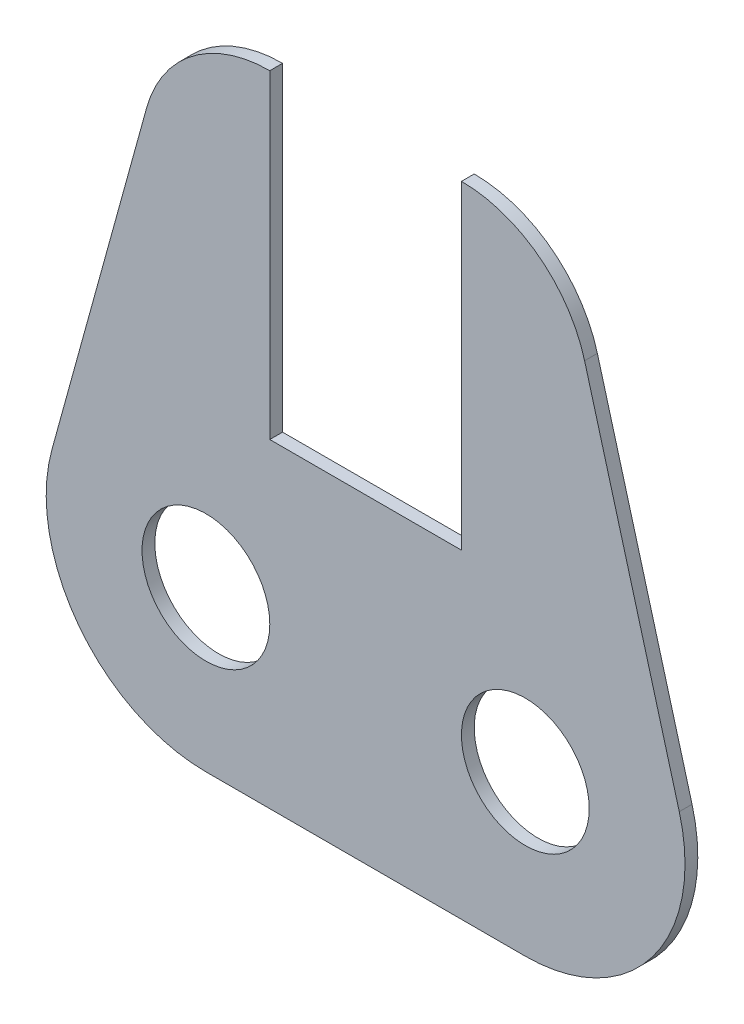
ISO-10303-21;
HEADER;
FILE_DESCRIPTION(('STEP AP214'),'2;1');
FILE_NAME('part.step','',(''),(''),'','','');
FILE_SCHEMA(('AUTOMOTIVE_DESIGN { 1 0 10303 214 1 1 1 1 }'));
ENDSEC;
DATA;
#1=APPLICATION_CONTEXT('core data for automotive mechanical design processes');
#2=APPLICATION_PROTOCOL_DEFINITION('international standard','automotive_design',2000,#1);
#3=PRODUCT_CONTEXT('',#1,'mechanical');
#4=PRODUCT('Part','Part','',(#3));
#5=PRODUCT_RELATED_PRODUCT_CATEGORY('part','',(#4));
#6=PRODUCT_DEFINITION_FORMATION('','',#4);
#7=PRODUCT_DEFINITION_CONTEXT('part definition',#1,'design');
#8=PRODUCT_DEFINITION('design','',#6,#7);
#9=PRODUCT_DEFINITION_SHAPE('','',#8);
#10=(LENGTH_UNIT() NAMED_UNIT(*) SI_UNIT(.MILLI.,.METRE.));
#11=(NAMED_UNIT(*) PLANE_ANGLE_UNIT() SI_UNIT($,.RADIAN.));
#12=(NAMED_UNIT(*) SI_UNIT($,.STERADIAN.) SOLID_ANGLE_UNIT());
#13=UNCERTAINTY_MEASURE_WITH_UNIT(LENGTH_MEASURE(1.E-05),#10,'distance_accuracy_value','');
#14=(GEOMETRIC_REPRESENTATION_CONTEXT(3) GLOBAL_UNCERTAINTY_ASSIGNED_CONTEXT((#13)) GLOBAL_UNIT_ASSIGNED_CONTEXT((#10,
#11,#12)) REPRESENTATION_CONTEXT('',''));
#15=CARTESIAN_POINT('',(0.,0.,0.));
#16=DIRECTION('',(0.,0.,1.));
#17=DIRECTION('',(1.,0.,0.));
#18=AXIS2_PLACEMENT_3D('',#15,#16,#17);
#19=CARTESIAN_POINT('',(15.0000000000186,80.,2.));
#20=DIRECTION('',(0.,0.,-1.));
#21=DIRECTION('',(-1.,0.,0.));
#22=AXIS2_PLACEMENT_3D('',#19,#20,#21);
#23=PLANE('',#22);
#24=CARTESIAN_POINT('',(15.0000000000186,80.,2.));
#25=DIRECTION('',(0.,0.,1.));
#26=DIRECTION('',(-1.,0.,0.));
#27=AXIS2_PLACEMENT_3D('',#24,#25,#26);
#28=CIRCLE('',#27,20.);
#29=CARTESIAN_POINT('',(34.2798014158517,85.3187646466109,2.));
#30=VERTEX_POINT('',#29);
#31=CARTESIAN_POINT('',(15.,100.,2.));
#32=VERTEX_POINT('',#31);
#33=EDGE_CURVE('E163',#30,#32,#28,.T.);
#34=ORIENTED_EDGE('',*,*,#33,.T.);
#35=DIRECTION('',(0.,-1.,0.));
#36=VECTOR('',#35,1.);
#37=CARTESIAN_POINT('',(15.,50.,2.));
#38=LINE('',#37,#36);
#39=CARTESIAN_POINT('',(15.,50.,2.));
#40=VERTEX_POINT('',#39);
#41=EDGE_CURVE('E101',#32,#40,#38,.T.);
#42=ORIENTED_EDGE('',*,*,#41,.T.);
#43=DIRECTION('',(-1.,0.,0.));
#44=VECTOR('',#43,1.);
#45=CARTESIAN_POINT('',(-15.,50.,2.));
#46=LINE('',#45,#44);
#47=CARTESIAN_POINT('',(-15.,50.,2.));
#48=VERTEX_POINT('',#47);
#49=EDGE_CURVE('E184',#40,#48,#46,.T.);
#50=ORIENTED_EDGE('',*,*,#49,.T.);
#51=DIRECTION('',(0.,1.,0.));
#52=VECTOR('',#51,1.);
#53=CARTESIAN_POINT('',(-15.,100.,2.));
#54=LINE('',#53,#52);
#55=CARTESIAN_POINT('',(-15.,100.,2.));
#56=VERTEX_POINT('',#55);
#57=EDGE_CURVE('E203',#48,#56,#54,.T.);
#58=ORIENTED_EDGE('',*,*,#57,.T.);
#59=CARTESIAN_POINT('',(-15.,80.,2.));
#60=DIRECTION('',(0.,0.,1.));
#61=DIRECTION('',(1.,0.,0.));
#62=AXIS2_PLACEMENT_3D('',#59,#60,#61);
#63=CIRCLE('',#62,20.);
#64=CARTESIAN_POINT('',(-34.2798014158344,85.3187646466062,2.));
#65=VERTEX_POINT('',#64);
#66=EDGE_CURVE('E200',#56,#65,#63,.T.);
#67=ORIENTED_EDGE('',*,*,#66,.T.);
#68=DIRECTION('',(-0.265938232330309,-0.963990070791723,0.));
#69=VECTOR('',#68,1.);
#70=CARTESIAN_POINT('',(-49.0997517697931,31.5984519797982,2.));
#71=LINE('',#70,#69);
#72=CARTESIAN_POINT('',(-49.0997517697931,31.5984519797982,2.));
#73=VERTEX_POINT('',#72);
#74=EDGE_CURVE('E202',#65,#73,#71,.T.);
#75=ORIENTED_EDGE('',*,*,#74,.T.);
#76=CARTESIAN_POINT('',(-25.,24.9499961715405,2.));
#77=DIRECTION('',(0.,0.,1.));
#78=DIRECTION('',(1.,0.,0.));
#79=AXIS2_PLACEMENT_3D('',#76,#77,#78);
#80=CIRCLE('',#79,25.);
#81=CARTESIAN_POINT('',(-25.,-0.0500038284594745,2.));
#82=VERTEX_POINT('',#81);
#83=EDGE_CURVE('E126',#73,#82,#80,.T.);
#84=ORIENTED_EDGE('',*,*,#83,.T.);
#85=DIRECTION('',(1.,0.,0.));
#86=VECTOR('',#85,1.);
#87=CARTESIAN_POINT('',(-25.,-0.0500038284594814,2.));
#88=LINE('',#87,#86);
#89=CARTESIAN_POINT('',(25.,-0.0500038284594918,2.));
#90=VERTEX_POINT('',#89);
#91=EDGE_CURVE('E120',#82,#90,#88,.T.);
#92=ORIENTED_EDGE('',*,*,#91,.T.);
#93=CARTESIAN_POINT('',(25.,24.9499961715405,2.));
#94=DIRECTION('',(0.,0.,1.));
#95=DIRECTION('',(1.,0.,0.));
#96=AXIS2_PLACEMENT_3D('',#93,#94,#95);
#97=CIRCLE('',#96,25.);
#98=CARTESIAN_POINT('',(49.0997517697952,31.5984519797905,2.));
#99=VERTEX_POINT('',#98);
#100=EDGE_CURVE('E124',#90,#99,#97,.T.);
#101=ORIENTED_EDGE('',*,*,#100,.T.);
#102=DIRECTION('',(-0.265938232329999,0.963990070791808,0.));
#103=VECTOR('',#102,1.);
#104=CARTESIAN_POINT('',(34.2798014158517,85.3187646466109,2.));
#105=LINE('',#104,#103);
#106=EDGE_CURVE('E52',#99,#30,#105,.T.);
#107=ORIENTED_EDGE('',*,*,#106,.T.);
#108=EDGE_LOOP('',(#34,#42,#50,#58,#67,#75,#84,#92,#101,#107));
#109=FACE_BOUND('',#108,.T.);
#110=CARTESIAN_POINT('',(25.,24.9499961715405,2.));
#111=DIRECTION('',(0.,0.,1.));
#112=DIRECTION('',(1.,0.,0.));
#113=AXIS2_PLACEMENT_3D('',#110,#111,#112);
#114=CIRCLE('',#113,10.);
#115=CARTESIAN_POINT('',(35.,24.9499961715405,2.));
#116=VERTEX_POINT('',#115);
#117=EDGE_CURVE('E148',#116,#116,#114,.T.);
#118=ORIENTED_EDGE('',*,*,#117,.F.);
#119=EDGE_LOOP('',(#118));
#120=FACE_BOUND('',#119,.T.);
#121=CARTESIAN_POINT('',(-25.,24.9499961715405,2.));
#122=DIRECTION('',(0.,0.,1.));
#123=DIRECTION('',(1.,0.,0.));
#124=AXIS2_PLACEMENT_3D('',#121,#122,#123);
#125=CIRCLE('',#124,10.);
#126=CARTESIAN_POINT('',(-15.,24.9499961715405,2.));
#127=VERTEX_POINT('',#126);
#128=EDGE_CURVE('E214',#127,#127,#125,.T.);
#129=ORIENTED_EDGE('',*,*,#128,.F.);
#130=EDGE_LOOP('',(#129));
#131=FACE_BOUND('',#130,.T.);
#132=ADVANCED_FACE('F35',(#109,#120,#131),#23,.F.);
#133=CARTESIAN_POINT('',(15.0000000000186,80.,0.));
#134=DIRECTION('',(0.,0.,-1.));
#135=DIRECTION('',(-1.,0.,0.));
#136=AXIS2_PLACEMENT_3D('',#133,#134,#135);
#137=PLANE('',#136);
#138=CARTESIAN_POINT('',(25.,24.9499961715405,0.));
#139=DIRECTION('',(0.,0.,1.));
#140=DIRECTION('',(1.,0.,0.));
#141=AXIS2_PLACEMENT_3D('',#138,#139,#140);
#142=CIRCLE('',#141,10.);
#143=CARTESIAN_POINT('',(35.,24.9499961715405,0.));
#144=VERTEX_POINT('',#143);
#145=EDGE_CURVE('E211',#144,#144,#142,.T.);
#146=ORIENTED_EDGE('',*,*,#145,.T.);
#147=EDGE_LOOP('',(#146));
#148=FACE_BOUND('',#147,.T.);
#149=CARTESIAN_POINT('',(15.0000000000186,80.,0.));
#150=DIRECTION('',(0.,0.,1.));
#151=DIRECTION('',(-1.,0.,0.));
#152=AXIS2_PLACEMENT_3D('',#149,#150,#151);
#153=CIRCLE('',#152,20.);
#154=CARTESIAN_POINT('',(34.2798014158517,85.3187646466109,0.));
#155=VERTEX_POINT('',#154);
#156=CARTESIAN_POINT('',(15.,100.,0.));
#157=VERTEX_POINT('',#156);
#158=EDGE_CURVE('E144',#155,#157,#153,.T.);
#159=ORIENTED_EDGE('',*,*,#158,.F.);
#160=DIRECTION('',(-0.265938232329999,0.963990070791808,0.));
#161=VECTOR('',#160,1.);
#162=CARTESIAN_POINT('',(34.2798014158517,85.3187646466109,0.));
#163=LINE('',#162,#161);
#164=CARTESIAN_POINT('',(49.0997517697952,31.5984519797905,0.));
#165=VERTEX_POINT('',#164);
#166=EDGE_CURVE('E93',#165,#155,#163,.T.);
#167=ORIENTED_EDGE('',*,*,#166,.F.);
#168=CARTESIAN_POINT('',(25.,24.9499961715405,0.));
#169=DIRECTION('',(0.,0.,1.));
#170=DIRECTION('',(1.,0.,0.));
#171=AXIS2_PLACEMENT_3D('',#168,#169,#170);
#172=CIRCLE('',#171,25.);
#173=CARTESIAN_POINT('',(25.,-0.0500038284594918,0.));
#174=VERTEX_POINT('',#173);
#175=EDGE_CURVE('E87',#174,#165,#172,.T.);
#176=ORIENTED_EDGE('',*,*,#175,.F.);
#177=DIRECTION('',(1.,0.,0.));
#178=VECTOR('',#177,1.);
#179=CARTESIAN_POINT('',(-25.,-0.0500038284594814,0.));
#180=LINE('',#179,#178);
#181=CARTESIAN_POINT('',(-25.,-0.0500038284594745,0.));
#182=VERTEX_POINT('',#181);
#183=EDGE_CURVE('E134',#182,#174,#180,.T.);
#184=ORIENTED_EDGE('',*,*,#183,.F.);
#185=CARTESIAN_POINT('',(-25.,24.9499961715405,0.));
#186=DIRECTION('',(0.,0.,1.));
#187=DIRECTION('',(1.,0.,0.));
#188=AXIS2_PLACEMENT_3D('',#185,#186,#187);
#189=CIRCLE('',#188,25.);
#190=CARTESIAN_POINT('',(-49.0997517697931,31.5984519797982,0.));
#191=VERTEX_POINT('',#190);
#192=EDGE_CURVE('E158',#191,#182,#189,.T.);
#193=ORIENTED_EDGE('',*,*,#192,.F.);
#194=DIRECTION('',(-0.265938232330309,-0.963990070791723,0.));
#195=VECTOR('',#194,1.);
#196=CARTESIAN_POINT('',(-49.0997517697931,31.5984519797982,0.));
#197=LINE('',#196,#195);
#198=CARTESIAN_POINT('',(-34.2798014158344,85.3187646466062,0.));
#199=VERTEX_POINT('',#198);
#200=EDGE_CURVE('E156',#199,#191,#197,.T.);
#201=ORIENTED_EDGE('',*,*,#200,.F.);
#202=CARTESIAN_POINT('',(-15.,80.,0.));
#203=DIRECTION('',(0.,0.,1.));
#204=DIRECTION('',(1.,0.,0.));
#205=AXIS2_PLACEMENT_3D('',#202,#203,#204);
#206=CIRCLE('',#205,20.);
#207=CARTESIAN_POINT('',(-15.,100.,0.));
#208=VERTEX_POINT('',#207);
#209=EDGE_CURVE('E154',#208,#199,#206,.T.);
#210=ORIENTED_EDGE('',*,*,#209,.F.);
#211=DIRECTION('',(0.,1.,0.));
#212=VECTOR('',#211,1.);
#213=CARTESIAN_POINT('',(-15.,100.,0.));
#214=LINE('',#213,#212);
#215=CARTESIAN_POINT('',(-15.,50.,0.));
#216=VERTEX_POINT('',#215);
#217=EDGE_CURVE('E152',#216,#208,#214,.T.);
#218=ORIENTED_EDGE('',*,*,#217,.F.);
#219=DIRECTION('',(-1.,0.,0.));
#220=VECTOR('',#219,1.);
#221=CARTESIAN_POINT('',(-15.,50.,0.));
#222=LINE('',#221,#220);
#223=CARTESIAN_POINT('',(15.,50.,0.));
#224=VERTEX_POINT('',#223);
#225=EDGE_CURVE('E150',#224,#216,#222,.T.);
#226=ORIENTED_EDGE('',*,*,#225,.F.);
#227=DIRECTION('',(0.,-1.,0.));
#228=VECTOR('',#227,1.);
#229=CARTESIAN_POINT('',(15.,50.,0.));
#230=LINE('',#229,#228);
#231=EDGE_CURVE('E147',#157,#224,#230,.T.);
#232=ORIENTED_EDGE('',*,*,#231,.F.);
#233=EDGE_LOOP('',(#159,#167,#176,#184,#193,#201,#210,#218,#226,#232));
#234=FACE_BOUND('',#233,.T.);
#235=CARTESIAN_POINT('',(-25.,24.9499961715405,0.));
#236=DIRECTION('',(0.,0.,1.));
#237=DIRECTION('',(1.,0.,0.));
#238=AXIS2_PLACEMENT_3D('',#235,#236,#237);
#239=CIRCLE('',#238,10.);
#240=CARTESIAN_POINT('',(-15.,24.9499961715405,0.));
#241=VERTEX_POINT('',#240);
#242=EDGE_CURVE('E217',#241,#241,#239,.T.);
#243=ORIENTED_EDGE('',*,*,#242,.T.);
#244=EDGE_LOOP('',(#243));
#245=FACE_BOUND('',#244,.T.);
#246=ADVANCED_FACE('F188',(#148,#234,#245),#137,.T.);
#247=CARTESIAN_POINT('',(15.0000000000186,80.,2.));
#248=DIRECTION('',(0.,0.,-1.));
#249=DIRECTION('',(-1.,0.,0.));
#250=AXIS2_PLACEMENT_3D('',#247,#248,#249);
#251=CYLINDRICAL_SURFACE('',#250,20.);
#252=ORIENTED_EDGE('',*,*,#158,.T.);
#253=DIRECTION('',(0.,0.,-1.));
#254=VECTOR('',#253,1.);
#255=CARTESIAN_POINT('',(15.,100.,2.));
#256=LINE('',#255,#254);
#257=EDGE_CURVE('E11',#32,#157,#256,.T.);
#258=ORIENTED_EDGE('',*,*,#257,.F.);
#259=ORIENTED_EDGE('',*,*,#33,.F.);
#260=DIRECTION('',(0.,0.,-1.));
#261=VECTOR('',#260,1.);
#262=CARTESIAN_POINT('',(34.2798014158517,85.3187646466109,2.));
#263=LINE('',#262,#261);
#264=EDGE_CURVE('E140',#30,#155,#263,.T.);
#265=ORIENTED_EDGE('',*,*,#264,.T.);
#266=EDGE_LOOP('',(#252,#258,#259,#265));
#267=FACE_BOUND('',#266,.T.);
#268=ADVANCED_FACE('F37',(#267),#251,.T.);
#269=CARTESIAN_POINT('',(15.,50.,2.));
#270=DIRECTION('',(1.,0.,0.));
#271=DIRECTION('',(0.,1.,0.));
#272=AXIS2_PLACEMENT_3D('',#269,#270,#271);
#273=PLANE('',#272);
#274=ORIENTED_EDGE('',*,*,#231,.T.);
#275=DIRECTION('',(0.,0.,-1.));
#276=VECTOR('',#275,1.);
#277=CARTESIAN_POINT('',(15.,50.,2.));
#278=LINE('',#277,#276);
#279=EDGE_CURVE('E44',#40,#224,#278,.T.);
#280=ORIENTED_EDGE('',*,*,#279,.F.);
#281=ORIENTED_EDGE('',*,*,#41,.F.);
#282=ORIENTED_EDGE('',*,*,#257,.T.);
#283=EDGE_LOOP('',(#274,#280,#281,#282));
#284=FACE_BOUND('',#283,.T.);
#285=ADVANCED_FACE('F257',(#284),#273,.F.);
#286=CARTESIAN_POINT('',(-15.,50.,2.));
#287=DIRECTION('',(0.,-1.,0.));
#288=DIRECTION('',(0.,0.,-1.));
#289=AXIS2_PLACEMENT_3D('',#286,#287,#288);
#290=PLANE('',#289);
#291=ORIENTED_EDGE('',*,*,#225,.T.);
#292=DIRECTION('',(0.,0.,-1.));
#293=VECTOR('',#292,1.);
#294=CARTESIAN_POINT('',(-15.,50.,2.));
#295=LINE('',#294,#293);
#296=EDGE_CURVE('E176',#48,#216,#295,.T.);
#297=ORIENTED_EDGE('',*,*,#296,.F.);
#298=ORIENTED_EDGE('',*,*,#49,.F.);
#299=ORIENTED_EDGE('',*,*,#279,.T.);
#300=EDGE_LOOP('',(#291,#297,#298,#299));
#301=FACE_BOUND('',#300,.T.);
#302=ADVANCED_FACE('F182',(#301),#290,.F.);
#303=CARTESIAN_POINT('',(-15.,100.,2.));
#304=DIRECTION('',(-1.,0.,0.));
#305=DIRECTION('',(0.,-1.,0.));
#306=AXIS2_PLACEMENT_3D('',#303,#304,#305);
#307=PLANE('',#306);
#308=ORIENTED_EDGE('',*,*,#217,.T.);
#309=DIRECTION('',(0.,0.,-1.));
#310=VECTOR('',#309,1.);
#311=CARTESIAN_POINT('',(-15.,100.,2.));
#312=LINE('',#311,#310);
#313=EDGE_CURVE('E173',#56,#208,#312,.T.);
#314=ORIENTED_EDGE('',*,*,#313,.F.);
#315=ORIENTED_EDGE('',*,*,#57,.F.);
#316=ORIENTED_EDGE('',*,*,#296,.T.);
#317=EDGE_LOOP('',(#308,#314,#315,#316));
#318=FACE_BOUND('',#317,.T.);
#319=ADVANCED_FACE('F194',(#318),#307,.F.);
#320=CARTESIAN_POINT('',(-15.,80.,2.));
#321=DIRECTION('',(0.,0.,-1.));
#322=DIRECTION('',(-1.,0.,0.));
#323=AXIS2_PLACEMENT_3D('',#320,#321,#322);
#324=CYLINDRICAL_SURFACE('',#323,20.);
#325=ORIENTED_EDGE('',*,*,#209,.T.);
#326=DIRECTION('',(0.,0.,-1.));
#327=VECTOR('',#326,1.);
#328=CARTESIAN_POINT('',(-34.2798014158344,85.3187646466062,2.));
#329=LINE('',#328,#327);
#330=EDGE_CURVE('E170',#65,#199,#329,.T.);
#331=ORIENTED_EDGE('',*,*,#330,.F.);
#332=ORIENTED_EDGE('',*,*,#66,.F.);
#333=ORIENTED_EDGE('',*,*,#313,.T.);
#334=EDGE_LOOP('',(#325,#331,#332,#333));
#335=FACE_BOUND('',#334,.T.);
#336=ADVANCED_FACE('F198',(#335),#324,.T.);
#337=CARTESIAN_POINT('',(-49.0997517697931,31.5984519797982,2.));
#338=DIRECTION('',(0.963990070791723,-0.265938232330309,0.));
#339=DIRECTION('',(0.265938232330309,0.963990070791723,0.));
#340=AXIS2_PLACEMENT_3D('',#337,#338,#339);
#341=PLANE('',#340);
#342=ORIENTED_EDGE('',*,*,#200,.T.);
#343=DIRECTION('',(0.,0.,-1.));
#344=VECTOR('',#343,1.);
#345=CARTESIAN_POINT('',(-49.0997517697931,31.5984519797982,2.));
#346=LINE('',#345,#344);
#347=EDGE_CURVE('E167',#73,#191,#346,.T.);
#348=ORIENTED_EDGE('',*,*,#347,.F.);
#349=ORIENTED_EDGE('',*,*,#74,.F.);
#350=ORIENTED_EDGE('',*,*,#330,.T.);
#351=EDGE_LOOP('',(#342,#348,#349,#350));
#352=FACE_BOUND('',#351,.T.);
#353=ADVANCED_FACE('F247',(#352),#341,.F.);
#354=CARTESIAN_POINT('',(-25.,24.9499961715405,2.));
#355=DIRECTION('',(0.,0.,-1.));
#356=DIRECTION('',(-1.,0.,0.));
#357=AXIS2_PLACEMENT_3D('',#354,#355,#356);
#358=CYLINDRICAL_SURFACE('',#357,25.);
#359=ORIENTED_EDGE('',*,*,#192,.T.);
#360=DIRECTION('',(0.,0.,-1.));
#361=VECTOR('',#360,1.);
#362=CARTESIAN_POINT('',(-25.,-0.0500038284594745,2.));
#363=LINE('',#362,#361);
#364=EDGE_CURVE('E135',#82,#182,#363,.T.);
#365=ORIENTED_EDGE('',*,*,#364,.F.);
#366=ORIENTED_EDGE('',*,*,#83,.F.);
#367=ORIENTED_EDGE('',*,*,#347,.T.);
#368=EDGE_LOOP('',(#359,#365,#366,#367));
#369=FACE_BOUND('',#368,.T.);
#370=ADVANCED_FACE('F244',(#369),#358,.T.);
#371=CARTESIAN_POINT('',(-25.,-0.0500038284594814,2.));
#372=DIRECTION('',(0.,1.,0.));
#373=DIRECTION('',(-1.,0.,0.));
#374=AXIS2_PLACEMENT_3D('',#371,#372,#373);
#375=PLANE('',#374);
#376=ORIENTED_EDGE('',*,*,#183,.T.);
#377=DIRECTION('',(0.,0.,-1.));
#378=VECTOR('',#377,1.);
#379=CARTESIAN_POINT('',(25.,-0.0500038284594918,2.));
#380=LINE('',#379,#378);
#381=EDGE_CURVE('E131',#90,#174,#380,.T.);
#382=ORIENTED_EDGE('',*,*,#381,.F.);
#383=ORIENTED_EDGE('',*,*,#91,.F.);
#384=ORIENTED_EDGE('',*,*,#364,.T.);
#385=EDGE_LOOP('',(#376,#382,#383,#384));
#386=FACE_BOUND('',#385,.T.);
#387=ADVANCED_FACE('F132',(#386),#375,.F.);
#388=CARTESIAN_POINT('',(25.,24.9499961715405,2.));
#389=DIRECTION('',(0.,0.,-1.));
#390=DIRECTION('',(-1.,0.,0.));
#391=AXIS2_PLACEMENT_3D('',#388,#389,#390);
#392=CYLINDRICAL_SURFACE('',#391,25.);
#393=ORIENTED_EDGE('',*,*,#175,.T.);
#394=DIRECTION('',(0.,0.,-1.));
#395=VECTOR('',#394,1.);
#396=CARTESIAN_POINT('',(49.0997517697952,31.5984519797905,2.));
#397=LINE('',#396,#395);
#398=EDGE_CURVE('E136',#99,#165,#397,.T.);
#399=ORIENTED_EDGE('',*,*,#398,.F.);
#400=ORIENTED_EDGE('',*,*,#100,.F.);
#401=ORIENTED_EDGE('',*,*,#381,.T.);
#402=EDGE_LOOP('',(#393,#399,#400,#401));
#403=FACE_BOUND('',#402,.T.);
#404=ADVANCED_FACE('F138',(#403),#392,.T.);
#405=CARTESIAN_POINT('',(34.2798014158517,85.3187646466109,2.));
#406=DIRECTION('',(-0.963990070791808,-0.265938232329999,0.));
#407=DIRECTION('',(0.265938232329999,-0.963990070791808,0.));
#408=AXIS2_PLACEMENT_3D('',#405,#406,#407);
#409=PLANE('',#408);
#410=ORIENTED_EDGE('',*,*,#166,.T.);
#411=ORIENTED_EDGE('',*,*,#264,.F.);
#412=ORIENTED_EDGE('',*,*,#106,.F.);
#413=ORIENTED_EDGE('',*,*,#398,.T.);
#414=EDGE_LOOP('',(#410,#411,#412,#413));
#415=FACE_BOUND('',#414,.T.);
#416=ADVANCED_FACE('F237',(#415),#409,.F.);
#417=CARTESIAN_POINT('',(25.,24.9499961715405,2.));
#418=DIRECTION('',(0.,0.,-1.));
#419=DIRECTION('',(-1.,0.,0.));
#420=AXIS2_PLACEMENT_3D('',#417,#418,#419);
#421=CYLINDRICAL_SURFACE('',#420,10.);
#422=ORIENTED_EDGE('',*,*,#117,.T.);
#423=EDGE_LOOP('',(#422));
#424=FACE_BOUND('',#423,.T.);
#425=ORIENTED_EDGE('',*,*,#145,.F.);
#426=EDGE_LOOP('',(#425));
#427=FACE_BOUND('',#426,.T.);
#428=ADVANCED_FACE('F234',(#424,#427),#421,.F.);
#429=CARTESIAN_POINT('',(-25.,24.9499961715405,2.));
#430=DIRECTION('',(0.,0.,-1.));
#431=DIRECTION('',(-1.,0.,0.));
#432=AXIS2_PLACEMENT_3D('',#429,#430,#431);
#433=CYLINDRICAL_SURFACE('',#432,10.);
#434=ORIENTED_EDGE('',*,*,#128,.T.);
#435=EDGE_LOOP('',(#434));
#436=FACE_BOUND('',#435,.T.);
#437=ORIENTED_EDGE('',*,*,#242,.F.);
#438=EDGE_LOOP('',(#437));
#439=FACE_BOUND('',#438,.T.);
#440=ADVANCED_FACE('F223',(#436,#439),#433,.F.);
#441=CLOSED_SHELL('',(#132,#246,#268,#285,#302,#319,#336,#353,#370,#387,#404,#416,#428,#440));
#442=MANIFOLD_SOLID_BREP('B2',#441);
#443=ADVANCED_BREP_SHAPE_REPRESENTATION('',(#18,#442),#14);
#444=SHAPE_DEFINITION_REPRESENTATION(#9,#443);
ENDSEC;
END-ISO-10303-21;
